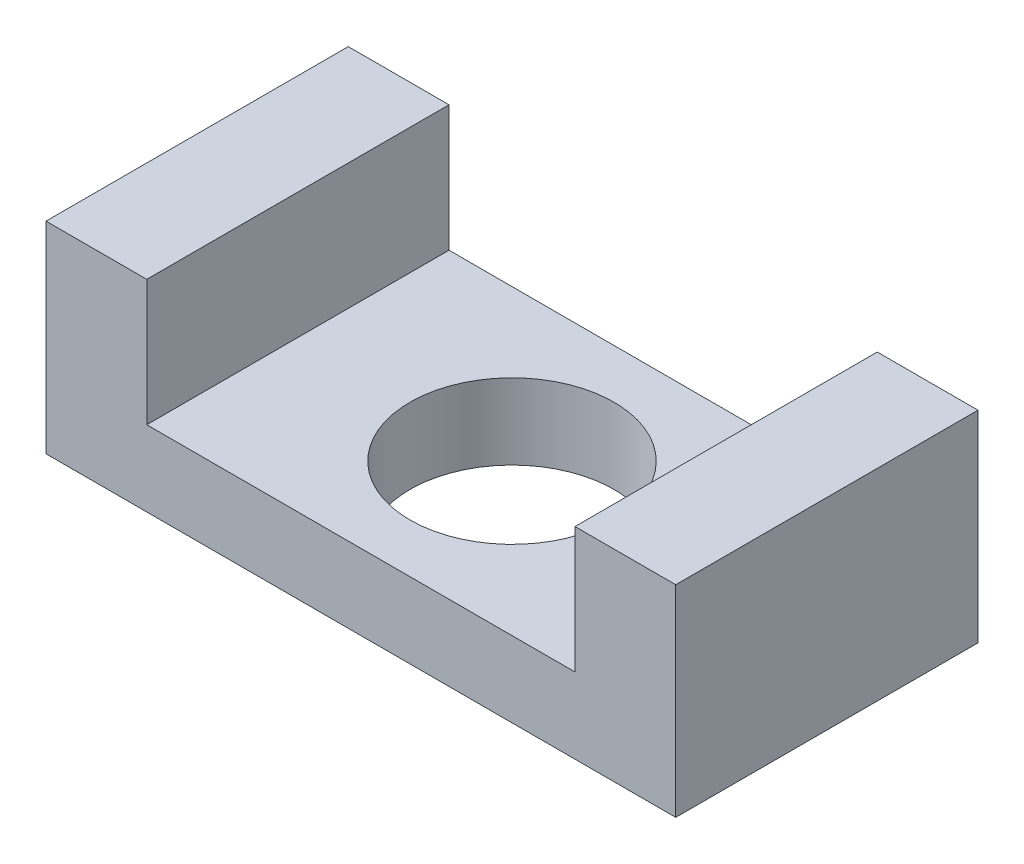
ISO-10303-21;
HEADER;
FILE_DESCRIPTION(('STEP AP214'),'2;1');
FILE_NAME('part.step','',(''),(''),'','','');
FILE_SCHEMA(('AUTOMOTIVE_DESIGN { 1 0 10303 214 1 1 1 1 }'));
ENDSEC;
DATA;
#1=APPLICATION_CONTEXT('core data for automotive mechanical design processes');
#2=APPLICATION_PROTOCOL_DEFINITION('international standard','automotive_design',2000,#1);
#3=PRODUCT_CONTEXT('',#1,'mechanical');
#4=PRODUCT('Part','Part','',(#3));
#5=PRODUCT_RELATED_PRODUCT_CATEGORY('part','',(#4));
#6=PRODUCT_DEFINITION_FORMATION('','',#4);
#7=PRODUCT_DEFINITION_CONTEXT('part definition',#1,'design');
#8=PRODUCT_DEFINITION('design','',#6,#7);
#9=PRODUCT_DEFINITION_SHAPE('','',#8);
#10=(LENGTH_UNIT() NAMED_UNIT(*) SI_UNIT(.MILLI.,.METRE.));
#11=(NAMED_UNIT(*) PLANE_ANGLE_UNIT() SI_UNIT($,.RADIAN.));
#12=(NAMED_UNIT(*) SI_UNIT($,.STERADIAN.) SOLID_ANGLE_UNIT());
#13=UNCERTAINTY_MEASURE_WITH_UNIT(LENGTH_MEASURE(1.E-05),#10,'distance_accuracy_value','');
#14=(GEOMETRIC_REPRESENTATION_CONTEXT(3) GLOBAL_UNCERTAINTY_ASSIGNED_CONTEXT((#13)) GLOBAL_UNIT_ASSIGNED_CONTEXT((#10,
#11,#12)) REPRESENTATION_CONTEXT('',''));
#15=CARTESIAN_POINT('',(0.,0.,0.));
#16=DIRECTION('',(0.,0.,1.));
#17=DIRECTION('',(1.,0.,0.));
#18=AXIS2_PLACEMENT_3D('',#15,#16,#17);
#19=CARTESIAN_POINT('',(0.,3.,0.));
#20=DIRECTION('',(0.,1.,0.));
#21=DIRECTION('',(0.,0.,1.));
#22=AXIS2_PLACEMENT_3D('',#19,#20,#21);
#23=PLANE('',#22);
#24=CARTESIAN_POINT('',(0.,3.,0.));
#25=DIRECTION('',(0.,1.,0.));
#26=DIRECTION('',(0.,0.,1.));
#27=AXIS2_PLACEMENT_3D('',#24,#25,#26);
#28=CIRCLE('',#27,4.05);
#29=CARTESIAN_POINT('',(0.,3.,4.05));
#30=VERTEX_POINT('',#29);
#31=EDGE_CURVE('E162',#30,#30,#28,.T.);
#32=ORIENTED_EDGE('',*,*,#31,.F.);
#33=EDGE_LOOP('',(#32));
#34=FACE_BOUND('',#33,.T.);
#35=DIRECTION('',(1.,0.,0.));
#36=VECTOR('',#35,1.);
#37=CARTESIAN_POINT('',(-12.5,3.,6.));
#38=LINE('',#37,#36);
#39=CARTESIAN_POINT('',(-8.5,3.,6.));
#40=VERTEX_POINT('',#39);
#41=CARTESIAN_POINT('',(8.5,3.,6.));
#42=VERTEX_POINT('',#41);
#43=EDGE_CURVE('E55',#40,#42,#38,.T.);
#44=ORIENTED_EDGE('',*,*,#43,.T.);
#45=DIRECTION('',(0.,0.,1.));
#46=VECTOR('',#45,1.);
#47=CARTESIAN_POINT('',(8.5,3.,-6.));
#48=LINE('',#47,#46);
#49=CARTESIAN_POINT('',(8.5,3.,-6.));
#50=VERTEX_POINT('',#49);
#51=EDGE_CURVE('E126',#50,#42,#48,.T.);
#52=ORIENTED_EDGE('',*,*,#51,.F.);
#53=DIRECTION('',(-1.,0.,0.));
#54=VECTOR('',#53,1.);
#55=CARTESIAN_POINT('',(-12.5,3.,-6.));
#56=LINE('',#55,#54);
#57=CARTESIAN_POINT('',(-8.5,3.,-6.));
#58=VERTEX_POINT('',#57);
#59=EDGE_CURVE('E130',#50,#58,#56,.T.);
#60=ORIENTED_EDGE('',*,*,#59,.T.);
#61=DIRECTION('',(0.,0.,-1.));
#62=VECTOR('',#61,1.);
#63=CARTESIAN_POINT('',(-8.5,3.,6.));
#64=LINE('',#63,#62);
#65=EDGE_CURVE('E60',#40,#58,#64,.T.);
#66=ORIENTED_EDGE('',*,*,#65,.F.);
#67=EDGE_LOOP('',(#44,#52,#60,#66));
#68=FACE_BOUND('',#67,.T.);
#69=ADVANCED_FACE('F39',(#34,#68),#23,.T.);
#70=CARTESIAN_POINT('',(0.,0.,0.));
#71=DIRECTION('',(0.,1.,0.));
#72=DIRECTION('',(0.,0.,1.));
#73=AXIS2_PLACEMENT_3D('',#70,#71,#72);
#74=PLANE('',#73);
#75=DIRECTION('',(1.,0.,0.));
#76=VECTOR('',#75,1.);
#77=CARTESIAN_POINT('',(-12.5,0.,6.));
#78=LINE('',#77,#76);
#79=CARTESIAN_POINT('',(-12.5,0.,6.));
#80=VERTEX_POINT('',#79);
#81=CARTESIAN_POINT('',(12.5,0.,6.));
#82=VERTEX_POINT('',#81);
#83=EDGE_CURVE('E166',#80,#82,#78,.T.);
#84=ORIENTED_EDGE('',*,*,#83,.F.);
#85=DIRECTION('',(0.,0.,1.));
#86=VECTOR('',#85,1.);
#87=CARTESIAN_POINT('',(-12.5,0.,6.));
#88=LINE('',#87,#86);
#89=CARTESIAN_POINT('',(-12.5,0.,-6.));
#90=VERTEX_POINT('',#89);
#91=EDGE_CURVE('E172',#90,#80,#88,.T.);
#92=ORIENTED_EDGE('',*,*,#91,.F.);
#93=DIRECTION('',(-1.,0.,0.));
#94=VECTOR('',#93,1.);
#95=CARTESIAN_POINT('',(-12.5,0.,-6.));
#96=LINE('',#95,#94);
#97=CARTESIAN_POINT('',(12.5,0.,-6.));
#98=VERTEX_POINT('',#97);
#99=EDGE_CURVE('E182',#98,#90,#96,.T.);
#100=ORIENTED_EDGE('',*,*,#99,.F.);
#101=DIRECTION('',(0.,0.,-1.));
#102=VECTOR('',#101,1.);
#103=CARTESIAN_POINT('',(12.5,0.,6.));
#104=LINE('',#103,#102);
#105=EDGE_CURVE('E179',#82,#98,#104,.T.);
#106=ORIENTED_EDGE('',*,*,#105,.F.);
#107=EDGE_LOOP('',(#84,#92,#100,#106));
#108=FACE_BOUND('',#107,.T.);
#109=CARTESIAN_POINT('',(0.,0.,0.));
#110=DIRECTION('',(0.,1.,0.));
#111=DIRECTION('',(0.,0.,1.));
#112=AXIS2_PLACEMENT_3D('',#109,#110,#111);
#113=CIRCLE('',#112,4.05);
#114=CARTESIAN_POINT('',(0.,0.,4.05));
#115=VERTEX_POINT('',#114);
#116=EDGE_CURVE('E161',#115,#115,#113,.T.);
#117=ORIENTED_EDGE('',*,*,#116,.T.);
#118=EDGE_LOOP('',(#117));
#119=FACE_BOUND('',#118,.T.);
#120=ADVANCED_FACE('F199',(#108,#119),#74,.F.);
#121=CARTESIAN_POINT('',(-12.5,3.,6.));
#122=DIRECTION('',(0.,0.,-1.));
#123=DIRECTION('',(-1.,0.,0.));
#124=AXIS2_PLACEMENT_3D('',#121,#122,#123);
#125=PLANE('',#124);
#126=ORIENTED_EDGE('',*,*,#83,.T.);
#127=DIRECTION('',(0.,-1.,0.));
#128=VECTOR('',#127,1.);
#129=CARTESIAN_POINT('',(12.5,3.,6.));
#130=LINE('',#129,#128);
#131=CARTESIAN_POINT('',(12.5,8.,6.));
#132=VERTEX_POINT('',#131);
#133=EDGE_CURVE('E11',#132,#82,#130,.T.);
#134=ORIENTED_EDGE('',*,*,#133,.F.);
#135=DIRECTION('',(1.,0.,0.));
#136=VECTOR('',#135,1.);
#137=CARTESIAN_POINT('',(12.5,8.,6.));
#138=LINE('',#137,#136);
#139=CARTESIAN_POINT('',(8.5,8.,6.));
#140=VERTEX_POINT('',#139);
#141=EDGE_CURVE('E115',#140,#132,#138,.T.);
#142=ORIENTED_EDGE('',*,*,#141,.F.);
#143=DIRECTION('',(0.,-1.,0.));
#144=VECTOR('',#143,1.);
#145=CARTESIAN_POINT('',(8.5,8.,6.));
#146=LINE('',#145,#144);
#147=EDGE_CURVE('E110',#140,#42,#146,.T.);
#148=ORIENTED_EDGE('',*,*,#147,.T.);
#149=ORIENTED_EDGE('',*,*,#43,.F.);
#150=DIRECTION('',(0.,-1.,0.));
#151=VECTOR('',#150,1.);
#152=CARTESIAN_POINT('',(-8.5,8.,6.));
#153=LINE('',#152,#151);
#154=CARTESIAN_POINT('',(-8.5,8.,6.));
#155=VERTEX_POINT('',#154);
#156=EDGE_CURVE('E157',#155,#40,#153,.T.);
#157=ORIENTED_EDGE('',*,*,#156,.F.);
#158=DIRECTION('',(1.,0.,0.));
#159=VECTOR('',#158,1.);
#160=CARTESIAN_POINT('',(-12.5,8.,6.));
#161=LINE('',#160,#159);
#162=CARTESIAN_POINT('',(-12.5,8.,6.));
#163=VERTEX_POINT('',#162);
#164=EDGE_CURVE('E135',#163,#155,#161,.T.);
#165=ORIENTED_EDGE('',*,*,#164,.F.);
#166=DIRECTION('',(0.,-1.,0.));
#167=VECTOR('',#166,1.);
#168=CARTESIAN_POINT('',(-12.5,3.,6.));
#169=LINE('',#168,#167);
#170=EDGE_CURVE('E175',#163,#80,#169,.T.);
#171=ORIENTED_EDGE('',*,*,#170,.T.);
#172=EDGE_LOOP('',(#126,#134,#142,#148,#149,#157,#165,#171));
#173=FACE_BOUND('',#172,.T.);
#174=ADVANCED_FACE('F41',(#173),#125,.F.);
#175=CARTESIAN_POINT('',(12.5,3.,6.));
#176=DIRECTION('',(-1.,0.,0.));
#177=DIRECTION('',(0.,0.,1.));
#178=AXIS2_PLACEMENT_3D('',#175,#176,#177);
#179=PLANE('',#178);
#180=ORIENTED_EDGE('',*,*,#105,.T.);
#181=DIRECTION('',(0.,-1.,0.));
#182=VECTOR('',#181,1.);
#183=CARTESIAN_POINT('',(12.5,3.,-6.));
#184=LINE('',#183,#182);
#185=CARTESIAN_POINT('',(12.5,8.,-6.));
#186=VERTEX_POINT('',#185);
#187=EDGE_CURVE('E48',#186,#98,#184,.T.);
#188=ORIENTED_EDGE('',*,*,#187,.F.);
#189=DIRECTION('',(0.,0.,-1.));
#190=VECTOR('',#189,1.);
#191=CARTESIAN_POINT('',(12.5,8.,-6.));
#192=LINE('',#191,#190);
#193=EDGE_CURVE('E122',#132,#186,#192,.T.);
#194=ORIENTED_EDGE('',*,*,#193,.F.);
#195=ORIENTED_EDGE('',*,*,#133,.T.);
#196=EDGE_LOOP('',(#180,#188,#194,#195));
#197=FACE_BOUND('',#196,.T.);
#198=ADVANCED_FACE('F235',(#197),#179,.F.);
#199=CARTESIAN_POINT('',(-12.5,3.,-6.));
#200=DIRECTION('',(0.,0.,1.));
#201=DIRECTION('',(1.,0.,0.));
#202=AXIS2_PLACEMENT_3D('',#199,#200,#201);
#203=PLANE('',#202);
#204=ORIENTED_EDGE('',*,*,#99,.T.);
#205=DIRECTION('',(0.,-1.,0.));
#206=VECTOR('',#205,1.);
#207=CARTESIAN_POINT('',(-12.5,3.,-6.));
#208=LINE('',#207,#206);
#209=CARTESIAN_POINT('',(-12.5,8.,-6.));
#210=VERTEX_POINT('',#209);
#211=EDGE_CURVE('E190',#210,#90,#208,.T.);
#212=ORIENTED_EDGE('',*,*,#211,.F.);
#213=DIRECTION('',(-1.,0.,0.));
#214=VECTOR('',#213,1.);
#215=CARTESIAN_POINT('',(-12.5,8.,-6.));
#216=LINE('',#215,#214);
#217=CARTESIAN_POINT('',(-8.5,8.,-6.));
#218=VERTEX_POINT('',#217);
#219=EDGE_CURVE('E146',#218,#210,#216,.T.);
#220=ORIENTED_EDGE('',*,*,#219,.F.);
#221=DIRECTION('',(0.,-1.,0.));
#222=VECTOR('',#221,1.);
#223=CARTESIAN_POINT('',(-8.5,8.,-6.));
#224=LINE('',#223,#222);
#225=EDGE_CURVE('E153',#218,#58,#224,.T.);
#226=ORIENTED_EDGE('',*,*,#225,.T.);
#227=ORIENTED_EDGE('',*,*,#59,.F.);
#228=DIRECTION('',(0.,-1.,0.));
#229=VECTOR('',#228,1.);
#230=CARTESIAN_POINT('',(8.5,8.,-6.));
#231=LINE('',#230,#229);
#232=CARTESIAN_POINT('',(8.5,8.,-6.));
#233=VERTEX_POINT('',#232);
#234=EDGE_CURVE('E108',#233,#50,#231,.T.);
#235=ORIENTED_EDGE('',*,*,#234,.F.);
#236=DIRECTION('',(-1.,0.,0.));
#237=VECTOR('',#236,1.);
#238=CARTESIAN_POINT('',(12.5,8.,-6.));
#239=LINE('',#238,#237);
#240=EDGE_CURVE('E116',#186,#233,#239,.T.);
#241=ORIENTED_EDGE('',*,*,#240,.F.);
#242=ORIENTED_EDGE('',*,*,#187,.T.);
#243=EDGE_LOOP('',(#204,#212,#220,#226,#227,#235,#241,#242));
#244=FACE_BOUND('',#243,.T.);
#245=ADVANCED_FACE('F128',(#244),#203,.F.);
#246=CARTESIAN_POINT('',(-12.5,3.,6.));
#247=DIRECTION('',(1.,0.,0.));
#248=DIRECTION('',(0.,0.,-1.));
#249=AXIS2_PLACEMENT_3D('',#246,#247,#248);
#250=PLANE('',#249);
#251=ORIENTED_EDGE('',*,*,#91,.T.);
#252=ORIENTED_EDGE('',*,*,#170,.F.);
#253=DIRECTION('',(0.,0.,1.));
#254=VECTOR('',#253,1.);
#255=CARTESIAN_POINT('',(-12.5,8.,6.));
#256=LINE('',#255,#254);
#257=EDGE_CURVE('E150',#210,#163,#256,.T.);
#258=ORIENTED_EDGE('',*,*,#257,.F.);
#259=ORIENTED_EDGE('',*,*,#211,.T.);
#260=EDGE_LOOP('',(#251,#252,#258,#259));
#261=FACE_BOUND('',#260,.T.);
#262=ADVANCED_FACE('F202',(#261),#250,.F.);
#263=CARTESIAN_POINT('',(0.,3.,0.));
#264=DIRECTION('',(0.,-1.,0.));
#265=DIRECTION('',(0.,0.,-1.));
#266=AXIS2_PLACEMENT_3D('',#263,#264,#265);
#267=CYLINDRICAL_SURFACE('',#266,4.05);
#268=ORIENTED_EDGE('',*,*,#31,.T.);
#269=EDGE_LOOP('',(#268));
#270=FACE_BOUND('',#269,.T.);
#271=ORIENTED_EDGE('',*,*,#116,.F.);
#272=EDGE_LOOP('',(#271));
#273=FACE_BOUND('',#272,.T.);
#274=ADVANCED_FACE('F214',(#270,#273),#267,.F.);
#275=CARTESIAN_POINT('',(-8.5,8.,6.));
#276=DIRECTION('',(-1.,0.,0.));
#277=DIRECTION('',(0.,0.,1.));
#278=AXIS2_PLACEMENT_3D('',#275,#276,#277);
#279=PLANE('',#278);
#280=ORIENTED_EDGE('',*,*,#65,.T.);
#281=ORIENTED_EDGE('',*,*,#225,.F.);
#282=DIRECTION('',(0.,0.,-1.));
#283=VECTOR('',#282,1.);
#284=CARTESIAN_POINT('',(-8.5,8.,6.));
#285=LINE('',#284,#283);
#286=EDGE_CURVE('E143',#155,#218,#285,.T.);
#287=ORIENTED_EDGE('',*,*,#286,.F.);
#288=ORIENTED_EDGE('',*,*,#156,.T.);
#289=EDGE_LOOP('',(#280,#281,#287,#288));
#290=FACE_BOUND('',#289,.T.);
#291=ADVANCED_FACE('F212',(#290),#279,.F.);
#292=CARTESIAN_POINT('',(0.,8.,0.));
#293=DIRECTION('',(0.,1.,0.));
#294=DIRECTION('',(0.,0.,1.));
#295=AXIS2_PLACEMENT_3D('',#292,#293,#294);
#296=PLANE('',#295);
#297=ORIENTED_EDGE('',*,*,#164,.T.);
#298=ORIENTED_EDGE('',*,*,#286,.T.);
#299=ORIENTED_EDGE('',*,*,#219,.T.);
#300=ORIENTED_EDGE('',*,*,#257,.T.);
#301=EDGE_LOOP('',(#297,#298,#299,#300));
#302=FACE_BOUND('',#301,.T.);
#303=ADVANCED_FACE('F208',(#302),#296,.T.);
#304=CARTESIAN_POINT('',(8.5,8.,-6.));
#305=DIRECTION('',(1.,0.,0.));
#306=DIRECTION('',(0.,0.,-1.));
#307=AXIS2_PLACEMENT_3D('',#304,#305,#306);
#308=PLANE('',#307);
#309=ORIENTED_EDGE('',*,*,#51,.T.);
#310=ORIENTED_EDGE('',*,*,#147,.F.);
#311=DIRECTION('',(0.,0.,1.));
#312=VECTOR('',#311,1.);
#313=CARTESIAN_POINT('',(8.5,8.,-6.));
#314=LINE('',#313,#312);
#315=EDGE_CURVE('E104',#233,#140,#314,.T.);
#316=ORIENTED_EDGE('',*,*,#315,.F.);
#317=ORIENTED_EDGE('',*,*,#234,.T.);
#318=EDGE_LOOP('',(#309,#310,#316,#317));
#319=FACE_BOUND('',#318,.T.);
#320=ADVANCED_FACE('F106',(#319),#308,.F.);
#321=CARTESIAN_POINT('',(0.,8.,0.));
#322=DIRECTION('',(0.,1.,0.));
#323=DIRECTION('',(0.,0.,1.));
#324=AXIS2_PLACEMENT_3D('',#321,#322,#323);
#325=PLANE('',#324);
#326=ORIENTED_EDGE('',*,*,#240,.T.);
#327=ORIENTED_EDGE('',*,*,#315,.T.);
#328=ORIENTED_EDGE('',*,*,#141,.T.);
#329=ORIENTED_EDGE('',*,*,#193,.T.);
#330=EDGE_LOOP('',(#326,#327,#328,#329));
#331=FACE_BOUND('',#330,.T.);
#332=ADVANCED_FACE('F120',(#331),#325,.T.);
#333=CLOSED_SHELL('',(#69,#120,#174,#198,#245,#262,#274,#291,#303,#320,#332));
#334=MANIFOLD_SOLID_BREP('B2',#333);
#335=ADVANCED_BREP_SHAPE_REPRESENTATION('',(#18,#334),#14);
#336=SHAPE_DEFINITION_REPRESENTATION(#9,#335);
ENDSEC;
END-ISO-10303-21;
